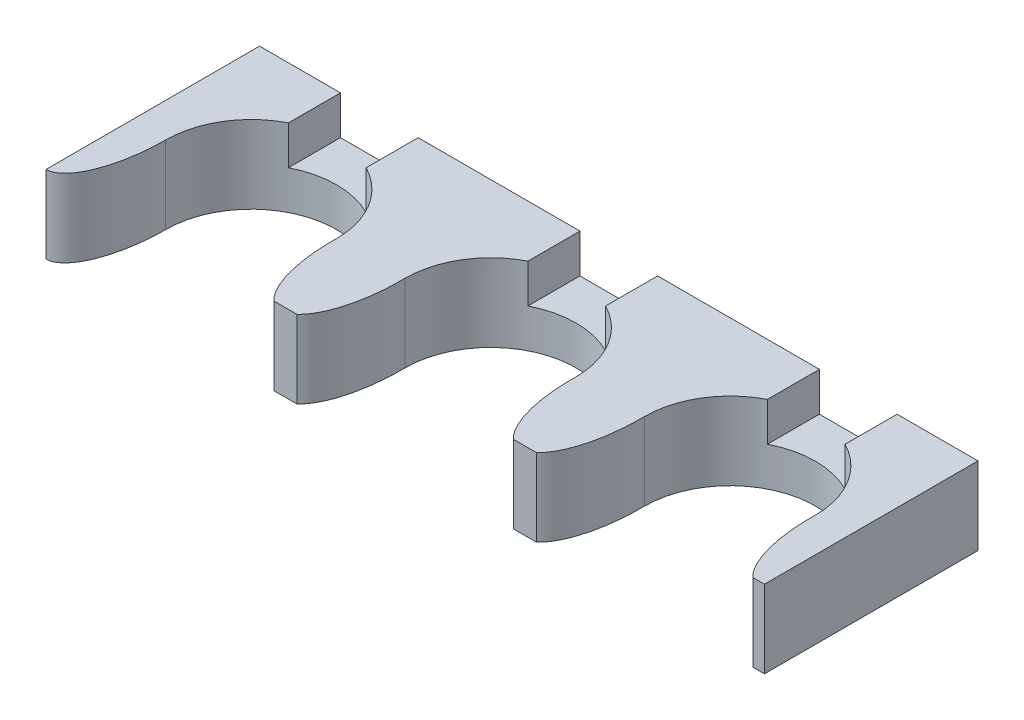
ISO-10303-21;
HEADER;
FILE_DESCRIPTION(('STEP AP214'),'2;1');
FILE_NAME('part.step','',(''),(''),'','','');
FILE_SCHEMA(('AUTOMOTIVE_DESIGN { 1 0 10303 214 1 1 1 1 }'));
ENDSEC;
DATA;
#1=APPLICATION_CONTEXT('core data for automotive mechanical design processes');
#2=APPLICATION_PROTOCOL_DEFINITION('international standard','automotive_design',2000,#1);
#3=PRODUCT_CONTEXT('',#1,'mechanical');
#4=PRODUCT('Part','Part','',(#3));
#5=PRODUCT_RELATED_PRODUCT_CATEGORY('part','',(#4));
#6=PRODUCT_DEFINITION_FORMATION('','',#4);
#7=PRODUCT_DEFINITION_CONTEXT('part definition',#1,'design');
#8=PRODUCT_DEFINITION('design','',#6,#7);
#9=PRODUCT_DEFINITION_SHAPE('','',#8);
#10=(LENGTH_UNIT() NAMED_UNIT(*) SI_UNIT(.MILLI.,.METRE.));
#11=(NAMED_UNIT(*) PLANE_ANGLE_UNIT() SI_UNIT($,.RADIAN.));
#12=(NAMED_UNIT(*) SI_UNIT($,.STERADIAN.) SOLID_ANGLE_UNIT());
#13=UNCERTAINTY_MEASURE_WITH_UNIT(LENGTH_MEASURE(1.E-05),#10,'distance_accuracy_value','');
#14=(GEOMETRIC_REPRESENTATION_CONTEXT(3) GLOBAL_UNCERTAINTY_ASSIGNED_CONTEXT((#13)) GLOBAL_UNIT_ASSIGNED_CONTEXT((#10,
#11,#12)) REPRESENTATION_CONTEXT('',''));
#15=CARTESIAN_POINT('',(0.,0.,0.));
#16=DIRECTION('',(0.,0.,1.));
#17=DIRECTION('',(1.,0.,0.));
#18=AXIS2_PLACEMENT_3D('',#15,#16,#17);
#19=CARTESIAN_POINT('',(-79.0983437687487,50.8,92.8118565395786));
#20=DIRECTION('',(0.,1.,0.));
#21=DIRECTION('',(0.,0.,1.));
#22=AXIS2_PLACEMENT_3D('',#19,#20,#21);
#23=PLANE('',#22);
#24=DIRECTION('',(0.,0.,-1.));
#25=VECTOR('',#24,1.);
#26=CARTESIAN_POINT('',(24.6174762312513,50.8,92.8118565395786));
#27=LINE('',#26,#25);
#28=CARTESIAN_POINT('',(24.6174762312513,50.8,-12.8421638829201));
#29=VERTEX_POINT('',#28);
#30=CARTESIAN_POINT('',(24.6174762312513,50.8,-46.8881434604214));
#31=VERTEX_POINT('',#30);
#32=EDGE_CURVE('E254',#29,#31,#27,.T.);
#33=ORIENTED_EDGE('',*,*,#32,.F.);
#34=CARTESIAN_POINT('',(-0.78176176874864,50.8,36.9318565395786));
#35=DIRECTION('',(0.,1.,0.));
#36=DIRECTION('',(0.,0.,1.));
#37=AXIS2_PLACEMENT_3D('',#34,#35,#36);
#38=CIRCLE('',#37,55.8799999999997);
#39=CARTESIAN_POINT('',(55.0982382312512,50.8,36.9318565395786));
#40=VERTEX_POINT('',#39);
#41=EDGE_CURVE('E402',#40,#29,#38,.T.);
#42=ORIENTED_EDGE('',*,*,#41,.F.);
#43=DIRECTION('',(0.,0.,1.));
#44=VECTOR('',#43,1.);
#45=CARTESIAN_POINT('',(55.0982382312514,50.8,22.9618565395786));
#46=LINE('',#45,#44);
#47=CARTESIAN_POINT('',(55.0982382312514,50.8,42.2665928727645));
#48=VERTEX_POINT('',#47);
#49=EDGE_CURVE('E395',#40,#48,#46,.T.);
#50=ORIENTED_EDGE('',*,*,#49,.T.);
#51=CARTESIAN_POINT('',(77.5180562312513,50.8,40.1068565395797));
#52=DIRECTION('',(0.,1.,0.));
#53=DIRECTION('',(0.,0.,1.));
#54=AXIS2_PLACEMENT_3D('',#51,#52,#53);
#55=ELLIPSE('',#54,55.8799999999989,22.4365820000002);
#56=CARTESIAN_POINT('',(70.0628942805316,50.8,92.8118565395786));
#57=VERTEX_POINT('',#56);
#58=EDGE_CURVE('E382',#48,#57,#55,.T.);
#59=ORIENTED_EDGE('',*,*,#58,.T.);
#60=DIRECTION('',(1.,0.,0.));
#61=VECTOR('',#60,1.);
#62=CARTESIAN_POINT('',(-79.0983437687487,50.8,92.8118565395786));
#63=LINE('',#62,#61);
#64=CARTESIAN_POINT('',(84.9732181819711,50.8,92.8118565395786));
#65=VERTEX_POINT('',#64);
#66=EDGE_CURVE('E457',#57,#65,#63,.T.);
#67=ORIENTED_EDGE('',*,*,#66,.T.);
#68=CARTESIAN_POINT('',(77.5180562312513,50.8,40.1068565395797));
#69=DIRECTION('',(0.,1.,0.));
#70=DIRECTION('',(0.,0.,1.));
#71=AXIS2_PLACEMENT_3D('',#68,#69,#70);
#72=ELLIPSE('',#71,55.8799999999989,22.4365820000002);
#73=CARTESIAN_POINT('',(99.9183928811012,50.8,36.9318565395786));
#74=VERTEX_POINT('',#73);
#75=EDGE_CURVE('E354',#65,#74,#72,.T.);
#76=ORIENTED_EDGE('',*,*,#75,.T.);
#77=DIRECTION('',(1.,0.,0.));
#78=VECTOR('',#77,1.);
#79=CARTESIAN_POINT('',(-259.81268432839,50.8,36.9318565395786));
#80=LINE('',#79,#78);
#81=CARTESIAN_POINT('',(99.9716562312513,50.8,36.9318565395786));
#82=VERTEX_POINT('',#81);
#83=EDGE_CURVE('E361',#74,#82,#80,.T.);
#84=ORIENTED_EDGE('',*,*,#83,.T.);
#85=CARTESIAN_POINT('',(155.851656231251,50.8,36.9318565395786));
#86=DIRECTION('',(0.,1.,0.));
#87=DIRECTION('',(0.,0.,1.));
#88=AXIS2_PLACEMENT_3D('',#85,#86,#87);
#89=CIRCLE('',#88,55.88);
#90=CARTESIAN_POINT('',(130.451656231251,50.8,-12.8417750337756));
#91=VERTEX_POINT('',#90);
#92=EDGE_CURVE('E426',#91,#82,#89,.T.);
#93=ORIENTED_EDGE('',*,*,#92,.F.);
#94=DIRECTION('',(0.,0.,-1.));
#95=VECTOR('',#94,1.);
#96=CARTESIAN_POINT('',(130.451656231251,50.8,92.8118565395786));
#97=LINE('',#96,#95);
#98=CARTESIAN_POINT('',(130.451656231251,50.8,-46.8881434604214));
#99=VERTEX_POINT('',#98);
#100=EDGE_CURVE('E280',#91,#99,#97,.T.);
#101=ORIENTED_EDGE('',*,*,#100,.T.);
#102=DIRECTION('',(-1.,0.,0.));
#103=VECTOR('',#102,1.);
#104=CARTESIAN_POINT('',(-79.0983437687487,50.8,-46.8881434604214));
#105=LINE('',#104,#103);
#106=EDGE_CURVE('E532',#99,#31,#105,.T.);
#107=ORIENTED_EDGE('',*,*,#106,.T.);
#108=EDGE_LOOP('',(#33,#42,#50,#59,#67,#76,#84,#93,#101,#107));
#109=FACE_BOUND('',#108,.T.);
#110=ADVANCED_FACE('F32',(#109),#23,.T.);
#111=DIRECTION('',(0.,0.,-1.));
#112=VECTOR('',#111,1.);
#113=CARTESIAN_POINT('',(181.251656231251,50.8,92.8118565395786));
#114=LINE('',#113,#112);
#115=CARTESIAN_POINT('',(181.251656231251,50.8,-12.8417750337756));
#116=VERTEX_POINT('',#115);
#117=CARTESIAN_POINT('',(181.251656231251,50.8,-46.8881434604214));
#118=VERTEX_POINT('',#117);
#119=EDGE_CURVE('E277',#116,#118,#114,.T.);
#120=ORIENTED_EDGE('',*,*,#119,.F.);
#121=CARTESIAN_POINT('',(211.731656231251,50.8,36.9318565395786));
#122=VERTEX_POINT('',#121);
#123=EDGE_CURVE('E420',#122,#116,#89,.T.);
#124=ORIENTED_EDGE('',*,*,#123,.F.);
#125=DIRECTION('',(0.,0.,1.));
#126=VECTOR('',#125,1.);
#127=CARTESIAN_POINT('',(211.731656231251,50.8,22.9618565395789));
#128=LINE('',#127,#126);
#129=CARTESIAN_POINT('',(211.731656231251,50.8,43.1721509155875));
#130=VERTEX_POINT('',#129);
#131=EDGE_CURVE('E414',#122,#130,#128,.T.);
#132=ORIENTED_EDGE('',*,*,#131,.T.);
#133=CARTESIAN_POINT('',(234.134456231251,50.8,40.1068565395797));
#134=DIRECTION('',(0.,1.,0.));
#135=DIRECTION('',(0.,0.,1.));
#136=AXIS2_PLACEMENT_3D('',#133,#134,#135);
#137=ELLIPSE('',#136,55.8799999999989,22.4365820000002);
#138=CARTESIAN_POINT('',(226.679294280532,50.8,92.8118565395786));
#139=VERTEX_POINT('',#138);
#140=EDGE_CURVE('E344',#130,#139,#137,.T.);
#141=ORIENTED_EDGE('',*,*,#140,.T.);
#142=CARTESIAN_POINT('',(241.589618181971,50.8,92.8118565395786));
#143=VERTEX_POINT('',#142);
#144=EDGE_CURVE('E461',#139,#143,#63,.T.);
#145=ORIENTED_EDGE('',*,*,#144,.T.);
#146=CARTESIAN_POINT('',(234.134456231251,50.8,40.1068565395797));
#147=DIRECTION('',(0.,1.,0.));
#148=DIRECTION('',(0.,0.,1.));
#149=AXIS2_PLACEMENT_3D('',#146,#147,#148);
#150=ELLIPSE('',#149,55.8799999999989,22.4365820000002);
#151=CARTESIAN_POINT('',(256.534792881101,50.8,36.9318565395786));
#152=VERTEX_POINT('',#151);
#153=EDGE_CURVE('E335',#143,#152,#150,.T.);
#154=ORIENTED_EDGE('',*,*,#153,.T.);
#155=DIRECTION('',(1.,0.,0.));
#156=VECTOR('',#155,1.);
#157=CARTESIAN_POINT('',(-259.81268432839,50.8,36.9318565395786));
#158=LINE('',#157,#156);
#159=CARTESIAN_POINT('',(256.605074231251,50.8,36.9318565395786));
#160=VERTEX_POINT('',#159);
#161=EDGE_CURVE('E332',#152,#160,#158,.T.);
#162=ORIENTED_EDGE('',*,*,#161,.T.);
#163=CARTESIAN_POINT('',(312.485074231251,50.8,36.9318565395786));
#164=DIRECTION('',(0.,1.,0.));
#165=DIRECTION('',(0.,0.,1.));
#166=AXIS2_PLACEMENT_3D('',#163,#164,#165);
#167=CIRCLE('',#166,55.88);
#168=CARTESIAN_POINT('',(287.085836231251,50.8,-12.8421638829205));
#169=VERTEX_POINT('',#168);
#170=EDGE_CURVE('E444',#169,#160,#167,.T.);
#171=ORIENTED_EDGE('',*,*,#170,.F.);
#172=DIRECTION('',(0.,0.,-1.));
#173=VECTOR('',#172,1.);
#174=CARTESIAN_POINT('',(287.085836231251,50.8,92.8118565395786));
#175=LINE('',#174,#173);
#176=CARTESIAN_POINT('',(287.085836231251,50.8,-46.8881434604214));
#177=VERTEX_POINT('',#176);
#178=EDGE_CURVE('E296',#169,#177,#175,.T.);
#179=ORIENTED_EDGE('',*,*,#178,.T.);
#180=EDGE_CURVE('E468',#177,#118,#105,.T.);
#181=ORIENTED_EDGE('',*,*,#180,.T.);
#182=EDGE_LOOP('',(#120,#124,#132,#141,#145,#154,#162,#171,#179,#181));
#183=FACE_BOUND('',#182,.T.);
#184=ADVANCED_FACE('F574',(#183),#23,.T.);
#185=DIRECTION('',(0.,0.,-1.));
#186=VECTOR('',#185,1.);
#187=CARTESIAN_POINT('',(337.885836231251,50.8,92.8118565395786));
#188=LINE('',#187,#186);
#189=CARTESIAN_POINT('',(337.885836231251,50.8,-12.841386169927));
#190=VERTEX_POINT('',#189);
#191=CARTESIAN_POINT('',(337.885836231251,50.8,-46.8881434604214));
#192=VERTEX_POINT('',#191);
#193=EDGE_CURVE('E293',#190,#192,#188,.T.);
#194=ORIENTED_EDGE('',*,*,#193,.F.);
#195=CARTESIAN_POINT('',(368.365074231251,50.8,36.9318565395786));
#196=VERTEX_POINT('',#195);
#197=EDGE_CURVE('E438',#196,#190,#167,.T.);
#198=ORIENTED_EDGE('',*,*,#197,.F.);
#199=DIRECTION('',(0.,0.,1.));
#200=VECTOR('',#199,1.);
#201=CARTESIAN_POINT('',(368.365074231251,50.8,22.9618565395792));
#202=LINE('',#201,#200);
#203=CARTESIAN_POINT('',(368.365074231251,50.8,43.8650482967298));
#204=VERTEX_POINT('',#203);
#205=EDGE_CURVE('E432',#196,#204,#202,.T.);
#206=ORIENTED_EDGE('',*,*,#205,.T.);
#207=CARTESIAN_POINT('',(390.750856231251,50.8,40.1068565395797));
#208=DIRECTION('',(0.,1.,0.));
#209=DIRECTION('',(0.,0.,1.));
#210=AXIS2_PLACEMENT_3D('',#207,#208,#209);
#211=ELLIPSE('',#210,55.8799999999989,22.4365820000002);
#212=CARTESIAN_POINT('',(383.295694280532,50.8,92.8118565395786));
#213=VERTEX_POINT('',#212);
#214=EDGE_CURVE('E295',#204,#213,#211,.T.);
#215=ORIENTED_EDGE('',*,*,#214,.T.);
#216=CARTESIAN_POINT('',(390.801656231251,50.8,92.8118565395786));
#217=VERTEX_POINT('',#216);
#218=EDGE_CURVE('E455',#213,#217,#63,.T.);
#219=ORIENTED_EDGE('',*,*,#218,.T.);
#220=DIRECTION('',(0.,0.,-1.));
#221=VECTOR('',#220,1.);
#222=CARTESIAN_POINT('',(390.801656231251,50.8,-46.8881434604214));
#223=LINE('',#222,#221);
#224=CARTESIAN_POINT('',(390.801656231251,50.8,-46.8881434604214));
#225=VERTEX_POINT('',#224);
#226=EDGE_CURVE('E460',#217,#225,#223,.T.);
#227=ORIENTED_EDGE('',*,*,#226,.T.);
#228=EDGE_CURVE('E464',#225,#192,#105,.T.);
#229=ORIENTED_EDGE('',*,*,#228,.T.);
#230=EDGE_LOOP('',(#194,#198,#206,#215,#219,#227,#229));
#231=FACE_BOUND('',#230,.T.);
#232=ADVANCED_FACE('F551',(#231),#23,.T.);
#233=DIRECTION('',(0.,0.,-1.));
#234=VECTOR('',#233,1.);
#235=CARTESIAN_POINT('',(-26.1825237687487,50.8,92.8118565395786));
#236=LINE('',#235,#234);
#237=CARTESIAN_POINT('',(-26.1825237687487,50.8,-12.8413861699266));
#238=VERTEX_POINT('',#237);
#239=CARTESIAN_POINT('',(-26.1825237687487,50.8,-46.8881434604214));
#240=VERTEX_POINT('',#239);
#241=EDGE_CURVE('E266',#238,#240,#236,.T.);
#242=ORIENTED_EDGE('',*,*,#241,.T.);
#243=CARTESIAN_POINT('',(-79.0983437687487,50.8,-46.8881434604214));
#244=VERTEX_POINT('',#243);
#245=EDGE_CURVE('E463',#240,#244,#105,.T.);
#246=ORIENTED_EDGE('',*,*,#245,.T.);
#247=DIRECTION('',(0.,0.,1.));
#248=VECTOR('',#247,1.);
#249=CARTESIAN_POINT('',(-79.0983437687487,50.8,-46.8881434604214));
#250=LINE('',#249,#248);
#251=CARTESIAN_POINT('',(-79.0983437687487,50.8,92.8118565395786));
#252=VERTEX_POINT('',#251);
#253=EDGE_CURVE('E452',#244,#252,#250,.T.);
#254=ORIENTED_EDGE('',*,*,#253,.T.);
#255=CARTESIAN_POINT('',(-79.0983437687487,50.8,36.9318565395786));
#256=DIRECTION('',(0.,1.,0.));
#257=DIRECTION('',(0.,0.,1.));
#258=AXIS2_PLACEMENT_3D('',#255,#256,#257);
#259=ELLIPSE('',#258,55.88,22.4365820000002);
#260=CARTESIAN_POINT('',(-56.6617617687487,50.8,36.9318565395786));
#261=VERTEX_POINT('',#260);
#262=EDGE_CURVE('E390',#252,#261,#259,.T.);
#263=ORIENTED_EDGE('',*,*,#262,.T.);
#264=EDGE_CURVE('E408',#238,#261,#38,.T.);
#265=ORIENTED_EDGE('',*,*,#264,.F.);
#266=EDGE_LOOP('',(#242,#246,#254,#263,#265));
#267=FACE_BOUND('',#266,.T.);
#268=ADVANCED_FACE('F514',(#267),#23,.T.);
#269=CARTESIAN_POINT('',(-79.0983437687487,0.,92.8118565395786));
#270=DIRECTION('',(0.,1.,0.));
#271=DIRECTION('',(0.,0.,1.));
#272=AXIS2_PLACEMENT_3D('',#269,#270,#271);
#273=PLANE('',#272);
#274=CARTESIAN_POINT('',(390.750856231251,0.,40.1068565395797));
#275=DIRECTION('',(0.,1.,0.));
#276=DIRECTION('',(0.,0.,1.));
#277=AXIS2_PLACEMENT_3D('',#274,#275,#276);
#278=ELLIPSE('',#277,55.8799999999989,22.4365820000002);
#279=CARTESIAN_POINT('',(368.365074231251,0.,43.8650482967298));
#280=VERTEX_POINT('',#279);
#281=CARTESIAN_POINT('',(383.295694280532,0.,92.8118565395786));
#282=VERTEX_POINT('',#281);
#283=EDGE_CURVE('E302',#280,#282,#278,.T.);
#284=ORIENTED_EDGE('',*,*,#283,.F.);
#285=DIRECTION('',(0.,0.,1.));
#286=VECTOR('',#285,1.);
#287=CARTESIAN_POINT('',(368.365074231251,0.,22.9618565395792));
#288=LINE('',#287,#286);
#289=CARTESIAN_POINT('',(368.365074231251,0.,36.9318565395786));
#290=VERTEX_POINT('',#289);
#291=EDGE_CURVE('E434',#290,#280,#288,.T.);
#292=ORIENTED_EDGE('',*,*,#291,.F.);
#293=CARTESIAN_POINT('',(312.485074231251,0.,36.9318565395786));
#294=DIRECTION('',(0.,1.,0.));
#295=DIRECTION('',(0.,0.,1.));
#296=AXIS2_PLACEMENT_3D('',#293,#294,#295);
#297=CIRCLE('',#296,55.88);
#298=CARTESIAN_POINT('',(256.605074231251,0.,36.9318565395786));
#299=VERTEX_POINT('',#298);
#300=EDGE_CURVE('E437',#290,#299,#297,.T.);
#301=ORIENTED_EDGE('',*,*,#300,.T.);
#302=DIRECTION('',(1.,0.,0.));
#303=VECTOR('',#302,1.);
#304=CARTESIAN_POINT('',(-259.81268432839,0.,36.9318565395786));
#305=LINE('',#304,#303);
#306=CARTESIAN_POINT('',(256.534792881101,0.,36.9318565395786));
#307=VERTEX_POINT('',#306);
#308=EDGE_CURVE('E331',#307,#299,#305,.T.);
#309=ORIENTED_EDGE('',*,*,#308,.F.);
#310=CARTESIAN_POINT('',(234.134456231251,0.,40.1068565395797));
#311=DIRECTION('',(0.,1.,0.));
#312=DIRECTION('',(0.,0.,1.));
#313=AXIS2_PLACEMENT_3D('',#310,#311,#312);
#314=ELLIPSE('',#313,55.8799999999989,22.4365820000002);
#315=CARTESIAN_POINT('',(241.589618181971,0.,92.8118565395786));
#316=VERTEX_POINT('',#315);
#317=EDGE_CURVE('E327',#316,#307,#314,.T.);
#318=ORIENTED_EDGE('',*,*,#317,.F.);
#319=DIRECTION('',(1.,0.,0.));
#320=VECTOR('',#319,1.);
#321=CARTESIAN_POINT('',(-79.0983437687487,0.,92.8118565395786));
#322=LINE('',#321,#320);
#323=CARTESIAN_POINT('',(226.679294280532,0.,92.8118565395786));
#324=VERTEX_POINT('',#323);
#325=EDGE_CURVE('E476',#324,#316,#322,.T.);
#326=ORIENTED_EDGE('',*,*,#325,.F.);
#327=CARTESIAN_POINT('',(234.134456231251,0.,40.1068565395797));
#328=DIRECTION('',(0.,1.,0.));
#329=DIRECTION('',(0.,0.,1.));
#330=AXIS2_PLACEMENT_3D('',#327,#328,#329);
#331=ELLIPSE('',#330,55.8799999999989,22.4365820000002);
#332=CARTESIAN_POINT('',(211.731656231251,0.,43.1721509155875));
#333=VERTEX_POINT('',#332);
#334=EDGE_CURVE('E346',#333,#324,#331,.T.);
#335=ORIENTED_EDGE('',*,*,#334,.F.);
#336=DIRECTION('',(0.,0.,1.));
#337=VECTOR('',#336,1.);
#338=CARTESIAN_POINT('',(211.731656231251,0.,22.9618565395789));
#339=LINE('',#338,#337);
#340=CARTESIAN_POINT('',(211.731656231251,0.,36.9318565395786));
#341=VERTEX_POINT('',#340);
#342=EDGE_CURVE('E416',#341,#333,#339,.T.);
#343=ORIENTED_EDGE('',*,*,#342,.F.);
#344=CARTESIAN_POINT('',(155.851656231251,0.,36.9318565395786));
#345=DIRECTION('',(0.,1.,0.));
#346=DIRECTION('',(0.,0.,1.));
#347=AXIS2_PLACEMENT_3D('',#344,#345,#346);
#348=CIRCLE('',#347,55.88);
#349=CARTESIAN_POINT('',(99.9716562312513,0.,36.9318565395786));
#350=VERTEX_POINT('',#349);
#351=EDGE_CURVE('E419',#341,#350,#348,.T.);
#352=ORIENTED_EDGE('',*,*,#351,.T.);
#353=DIRECTION('',(1.,0.,0.));
#354=VECTOR('',#353,1.);
#355=CARTESIAN_POINT('',(-259.81268432839,0.,36.9318565395786));
#356=LINE('',#355,#354);
#357=CARTESIAN_POINT('',(99.9183928811012,0.,36.9318565395786));
#358=VERTEX_POINT('',#357);
#359=EDGE_CURVE('E360',#358,#350,#356,.T.);
#360=ORIENTED_EDGE('',*,*,#359,.F.);
#361=CARTESIAN_POINT('',(77.5180562312513,0.,40.1068565395797));
#362=DIRECTION('',(0.,1.,0.));
#363=DIRECTION('',(0.,0.,1.));
#364=AXIS2_PLACEMENT_3D('',#361,#362,#363);
#365=ELLIPSE('',#364,55.8799999999989,22.4365820000002);
#366=CARTESIAN_POINT('',(84.9732181819711,0.,92.8118565395786));
#367=VERTEX_POINT('',#366);
#368=EDGE_CURVE('E357',#367,#358,#365,.T.);
#369=ORIENTED_EDGE('',*,*,#368,.F.);
#370=CARTESIAN_POINT('',(70.0628942805316,0.,92.8118565395786));
#371=VERTEX_POINT('',#370);
#372=EDGE_CURVE('E472',#371,#367,#322,.T.);
#373=ORIENTED_EDGE('',*,*,#372,.F.);
#374=CARTESIAN_POINT('',(77.5180562312513,0.,40.1068565395797));
#375=DIRECTION('',(0.,1.,0.));
#376=DIRECTION('',(0.,0.,1.));
#377=AXIS2_PLACEMENT_3D('',#374,#375,#376);
#378=ELLIPSE('',#377,55.8799999999989,22.4365820000002);
#379=CARTESIAN_POINT('',(55.0982382312514,0.,42.2665928727645));
#380=VERTEX_POINT('',#379);
#381=EDGE_CURVE('E377',#380,#371,#378,.T.);
#382=ORIENTED_EDGE('',*,*,#381,.F.);
#383=DIRECTION('',(0.,0.,1.));
#384=VECTOR('',#383,1.);
#385=CARTESIAN_POINT('',(55.0982382312514,0.,22.9618565395786));
#386=LINE('',#385,#384);
#387=CARTESIAN_POINT('',(55.0982382312512,0.,36.9318565395786));
#388=VERTEX_POINT('',#387);
#389=EDGE_CURVE('E398',#388,#380,#386,.T.);
#390=ORIENTED_EDGE('',*,*,#389,.F.);
#391=CARTESIAN_POINT('',(-0.78176176874864,0.,36.9318565395786));
#392=DIRECTION('',(0.,1.,0.));
#393=DIRECTION('',(0.,0.,1.));
#394=AXIS2_PLACEMENT_3D('',#391,#392,#393);
#395=CIRCLE('',#394,55.8799999999997);
#396=CARTESIAN_POINT('',(-56.6617617687483,0.,36.9318565395786));
#397=VERTEX_POINT('',#396);
#398=EDGE_CURVE('E401',#388,#397,#395,.T.);
#399=ORIENTED_EDGE('',*,*,#398,.T.);
#400=CARTESIAN_POINT('',(-79.0983437687487,0.,36.9318565395786));
#401=DIRECTION('',(0.,1.,0.));
#402=DIRECTION('',(0.,0.,1.));
#403=AXIS2_PLACEMENT_3D('',#400,#401,#402);
#404=ELLIPSE('',#403,55.88,22.4365820000002);
#405=CARTESIAN_POINT('',(-79.0983437687487,0.,92.8118565395786));
#406=VERTEX_POINT('',#405);
#407=EDGE_CURVE('E392',#406,#397,#404,.T.);
#408=ORIENTED_EDGE('',*,*,#407,.F.);
#409=DIRECTION('',(0.,0.,1.));
#410=VECTOR('',#409,1.);
#411=CARTESIAN_POINT('',(-79.0983437687487,0.,-46.8881434604214));
#412=LINE('',#411,#410);
#413=CARTESIAN_POINT('',(-79.0983437687487,0.,-46.8881434604214));
#414=VERTEX_POINT('',#413);
#415=EDGE_CURVE('E450',#414,#406,#412,.T.);
#416=ORIENTED_EDGE('',*,*,#415,.F.);
#417=DIRECTION('',(-1.,0.,0.));
#418=VECTOR('',#417,1.);
#419=CARTESIAN_POINT('',(-79.0983437687487,0.,-46.8881434604214));
#420=LINE('',#419,#418);
#421=CARTESIAN_POINT('',(390.801656231251,0.,-46.8881434604214));
#422=VERTEX_POINT('',#421);
#423=EDGE_CURVE('E456',#422,#414,#420,.T.);
#424=ORIENTED_EDGE('',*,*,#423,.F.);
#425=DIRECTION('',(0.,0.,-1.));
#426=VECTOR('',#425,1.);
#427=CARTESIAN_POINT('',(390.801656231251,0.,-46.8881434604214));
#428=LINE('',#427,#426);
#429=CARTESIAN_POINT('',(390.801656231251,0.,92.8118565395786));
#430=VERTEX_POINT('',#429);
#431=EDGE_CURVE('E475',#430,#422,#428,.T.);
#432=ORIENTED_EDGE('',*,*,#431,.F.);
#433=EDGE_CURVE('E471',#282,#430,#322,.T.);
#434=ORIENTED_EDGE('',*,*,#433,.F.);
#435=EDGE_LOOP('',(#284,#292,#301,#309,#318,#326,#335,#343,#352,#360,#369,#373,#382,#390,#399,
#408,#416,#424,#432,#434));
#436=FACE_BOUND('',#435,.T.);
#437=ADVANCED_FACE('F523',(#436),#273,.F.);
#438=CARTESIAN_POINT('',(-79.0983437687487,50.8,92.8118565395786));
#439=DIRECTION('',(0.,0.,-1.));
#440=DIRECTION('',(-1.,0.,0.));
#441=AXIS2_PLACEMENT_3D('',#438,#439,#440);
#442=PLANE('',#441);
#443=DIRECTION('',(0.,1.,0.));
#444=VECTOR('',#443,1.);
#445=CARTESIAN_POINT('',(383.295694280532,0.,92.8118565395786));
#446=LINE('',#445,#444);
#447=EDGE_CURVE('E338',#282,#213,#446,.T.);
#448=ORIENTED_EDGE('',*,*,#447,.F.);
#449=ORIENTED_EDGE('',*,*,#433,.T.);
#450=DIRECTION('',(0.,-1.,0.));
#451=VECTOR('',#450,1.);
#452=CARTESIAN_POINT('',(390.801656231251,50.8,92.8118565395786));
#453=LINE('',#452,#451);
#454=EDGE_CURVE('E484',#217,#430,#453,.T.);
#455=ORIENTED_EDGE('',*,*,#454,.F.);
#456=ORIENTED_EDGE('',*,*,#218,.F.);
#457=EDGE_LOOP('',(#448,#449,#455,#456));
#458=FACE_BOUND('',#457,.T.);
#459=ADVANCED_FACE('F557',(#458),#442,.F.);
#460=CARTESIAN_POINT('',(368.365074231251,0.,22.9618565395792));
#461=DIRECTION('',(-1.,0.,0.));
#462=DIRECTION('',(0.,0.,1.));
#463=AXIS2_PLACEMENT_3D('',#460,#461,#462);
#464=PLANE('',#463);
#465=ORIENTED_EDGE('',*,*,#291,.T.);
#466=DIRECTION('',(0.,1.,0.));
#467=VECTOR('',#466,1.);
#468=CARTESIAN_POINT('',(368.365074231251,0.,43.8650482967298));
#469=LINE('',#468,#467);
#470=EDGE_CURVE('E305',#280,#204,#469,.T.);
#471=ORIENTED_EDGE('',*,*,#470,.T.);
#472=ORIENTED_EDGE('',*,*,#205,.F.);
#473=DIRECTION('',(0.,1.,0.));
#474=VECTOR('',#473,1.);
#475=CARTESIAN_POINT('',(368.365074231251,0.,36.9318565395786));
#476=LINE('',#475,#474);
#477=EDGE_CURVE('E441',#290,#196,#476,.T.);
#478=ORIENTED_EDGE('',*,*,#477,.F.);
#479=EDGE_LOOP('',(#465,#471,#472,#478));
#480=FACE_BOUND('',#479,.T.);
#481=ADVANCED_FACE('F606',(#480),#464,.T.);
#482=DIRECTION('',(0.,1.,0.));
#483=VECTOR('',#482,1.);
#484=CARTESIAN_POINT('',(241.589618181971,0.,92.8118565395786));
#485=LINE('',#484,#483);
#486=EDGE_CURVE('E334',#316,#143,#485,.T.);
#487=ORIENTED_EDGE('',*,*,#486,.T.);
#488=ORIENTED_EDGE('',*,*,#144,.F.);
#489=DIRECTION('',(0.,1.,0.));
#490=VECTOR('',#489,1.);
#491=CARTESIAN_POINT('',(226.679294280532,0.,92.8118565395786));
#492=LINE('',#491,#490);
#493=EDGE_CURVE('E352',#324,#139,#492,.T.);
#494=ORIENTED_EDGE('',*,*,#493,.F.);
#495=ORIENTED_EDGE('',*,*,#325,.T.);
#496=EDGE_LOOP('',(#487,#488,#494,#495));
#497=FACE_BOUND('',#496,.T.);
#498=ADVANCED_FACE('F562',(#497),#442,.F.);
#499=CARTESIAN_POINT('',(211.731656231251,0.,22.9618565395789));
#500=DIRECTION('',(-1.,0.,0.));
#501=DIRECTION('',(0.,0.,1.));
#502=AXIS2_PLACEMENT_3D('',#499,#500,#501);
#503=PLANE('',#502);
#504=ORIENTED_EDGE('',*,*,#342,.T.);
#505=DIRECTION('',(0.,1.,0.));
#506=VECTOR('',#505,1.);
#507=CARTESIAN_POINT('',(211.731656231251,0.,43.1721509155875));
#508=LINE('',#507,#506);
#509=EDGE_CURVE('E349',#333,#130,#508,.T.);
#510=ORIENTED_EDGE('',*,*,#509,.T.);
#511=ORIENTED_EDGE('',*,*,#131,.F.);
#512=DIRECTION('',(0.,1.,0.));
#513=VECTOR('',#512,1.);
#514=CARTESIAN_POINT('',(211.731656231251,0.,36.9318565395786));
#515=LINE('',#514,#513);
#516=EDGE_CURVE('E423',#341,#122,#515,.T.);
#517=ORIENTED_EDGE('',*,*,#516,.F.);
#518=EDGE_LOOP('',(#504,#510,#511,#517));
#519=FACE_BOUND('',#518,.T.);
#520=ADVANCED_FACE('F579',(#519),#503,.T.);
#521=DIRECTION('',(0.,1.,0.));
#522=VECTOR('',#521,1.);
#523=CARTESIAN_POINT('',(84.9732181819711,0.,92.8118565395786));
#524=LINE('',#523,#522);
#525=EDGE_CURVE('E383',#367,#65,#524,.T.);
#526=ORIENTED_EDGE('',*,*,#525,.T.);
#527=ORIENTED_EDGE('',*,*,#66,.F.);
#528=DIRECTION('',(0.,1.,0.));
#529=VECTOR('',#528,1.);
#530=CARTESIAN_POINT('',(70.0628942805316,0.,92.8118565395786));
#531=LINE('',#530,#529);
#532=EDGE_CURVE('E388',#371,#57,#531,.T.);
#533=ORIENTED_EDGE('',*,*,#532,.F.);
#534=ORIENTED_EDGE('',*,*,#372,.T.);
#535=EDGE_LOOP('',(#526,#527,#533,#534));
#536=FACE_BOUND('',#535,.T.);
#537=ADVANCED_FACE('F595',(#536),#442,.F.);
#538=CARTESIAN_POINT('',(55.0982382312514,0.,22.9618565395786));
#539=DIRECTION('',(-1.,0.,0.));
#540=DIRECTION('',(0.,0.,1.));
#541=AXIS2_PLACEMENT_3D('',#538,#539,#540);
#542=PLANE('',#541);
#543=ORIENTED_EDGE('',*,*,#389,.T.);
#544=DIRECTION('',(0.,1.,0.));
#545=VECTOR('',#544,1.);
#546=CARTESIAN_POINT('',(55.0982382312514,0.,42.2665928727645));
#547=LINE('',#546,#545);
#548=EDGE_CURVE('E381',#380,#48,#547,.T.);
#549=ORIENTED_EDGE('',*,*,#548,.T.);
#550=ORIENTED_EDGE('',*,*,#49,.F.);
#551=DIRECTION('',(0.,1.,0.));
#552=VECTOR('',#551,1.);
#553=CARTESIAN_POINT('',(55.0982382312512,0.,36.9318565395786));
#554=LINE('',#553,#552);
#555=EDGE_CURVE('E405',#388,#40,#554,.T.);
#556=ORIENTED_EDGE('',*,*,#555,.F.);
#557=EDGE_LOOP('',(#543,#549,#550,#556));
#558=FACE_BOUND('',#557,.T.);
#559=ADVANCED_FACE('F528',(#558),#542,.T.);
#560=CARTESIAN_POINT('',(-79.0983437687487,50.8,-46.8881434604214));
#561=DIRECTION('',(1.,0.,0.));
#562=DIRECTION('',(0.,0.,-1.));
#563=AXIS2_PLACEMENT_3D('',#560,#561,#562);
#564=PLANE('',#563);
#565=ORIENTED_EDGE('',*,*,#415,.T.);
#566=DIRECTION('',(0.,-1.,0.));
#567=VECTOR('',#566,1.);
#568=CARTESIAN_POINT('',(-79.0983437687487,50.8,92.8118565395786));
#569=LINE('',#568,#567);
#570=EDGE_CURVE('E487',#252,#406,#569,.T.);
#571=ORIENTED_EDGE('',*,*,#570,.F.);
#572=ORIENTED_EDGE('',*,*,#253,.F.);
#573=DIRECTION('',(0.,-1.,0.));
#574=VECTOR('',#573,1.);
#575=CARTESIAN_POINT('',(-79.0983437687487,50.8,-46.8881434604214));
#576=LINE('',#575,#574);
#577=EDGE_CURVE('E467',#244,#414,#576,.T.);
#578=ORIENTED_EDGE('',*,*,#577,.T.);
#579=EDGE_LOOP('',(#565,#571,#572,#578));
#580=FACE_BOUND('',#579,.T.);
#581=ADVANCED_FACE('F34',(#580),#564,.F.);
#582=CARTESIAN_POINT('',(390.801656231251,50.8,-46.8881434604214));
#583=DIRECTION('',(-1.,0.,0.));
#584=DIRECTION('',(0.,0.,1.));
#585=AXIS2_PLACEMENT_3D('',#582,#583,#584);
#586=PLANE('',#585);
#587=ORIENTED_EDGE('',*,*,#431,.T.);
#588=DIRECTION('',(0.,-1.,0.));
#589=VECTOR('',#588,1.);
#590=CARTESIAN_POINT('',(390.801656231251,50.8,-46.8881434604214));
#591=LINE('',#590,#589);
#592=EDGE_CURVE('E481',#225,#422,#591,.T.);
#593=ORIENTED_EDGE('',*,*,#592,.F.);
#594=ORIENTED_EDGE('',*,*,#226,.F.);
#595=ORIENTED_EDGE('',*,*,#454,.T.);
#596=EDGE_LOOP('',(#587,#593,#594,#595));
#597=FACE_BOUND('',#596,.T.);
#598=ADVANCED_FACE('F543',(#597),#586,.F.);
#599=CARTESIAN_POINT('',(-79.0983437687487,50.8,-46.8881434604214));
#600=DIRECTION('',(0.,0.,1.));
#601=DIRECTION('',(1.,0.,0.));
#602=AXIS2_PLACEMENT_3D('',#599,#600,#601);
#603=PLANE('',#602);
#604=DIRECTION('',(-1.,0.,0.));
#605=VECTOR('',#604,1.);
#606=CARTESIAN_POINT('',(24.6174762312513,25.4,-46.8881434604214));
#607=LINE('',#606,#605);
#608=CARTESIAN_POINT('',(24.6174762312513,25.4,-46.8881434604214));
#609=VERTEX_POINT('',#608);
#610=CARTESIAN_POINT('',(-26.1825237687487,25.4,-46.8881434604214));
#611=VERTEX_POINT('',#610);
#612=EDGE_CURVE('E243',#609,#611,#607,.T.);
#613=ORIENTED_EDGE('',*,*,#612,.F.);
#614=DIRECTION('',(0.,-1.,0.));
#615=VECTOR('',#614,1.);
#616=CARTESIAN_POINT('',(24.6174762312513,50.8,-46.8881434604214));
#617=LINE('',#616,#615);
#618=EDGE_CURVE('E251',#31,#609,#617,.T.);
#619=ORIENTED_EDGE('',*,*,#618,.F.);
#620=ORIENTED_EDGE('',*,*,#106,.F.);
#621=DIRECTION('',(0.,1.,0.));
#622=VECTOR('',#621,1.);
#623=CARTESIAN_POINT('',(130.451656231251,50.8,-46.8881434604214));
#624=LINE('',#623,#622);
#625=CARTESIAN_POINT('',(130.451656231251,25.4,-46.8881434604214));
#626=VERTEX_POINT('',#625);
#627=EDGE_CURVE('E274',#626,#99,#624,.T.);
#628=ORIENTED_EDGE('',*,*,#627,.F.);
#629=DIRECTION('',(-1.,0.,0.));
#630=VECTOR('',#629,1.);
#631=CARTESIAN_POINT('',(181.251656231251,25.4,-46.8881434604214));
#632=LINE('',#631,#630);
#633=CARTESIAN_POINT('',(181.251656231251,25.4,-46.8881434604214));
#634=VERTEX_POINT('',#633);
#635=EDGE_CURVE('E272',#634,#626,#632,.T.);
#636=ORIENTED_EDGE('',*,*,#635,.F.);
#637=DIRECTION('',(0.,-1.,0.));
#638=VECTOR('',#637,1.);
#639=CARTESIAN_POINT('',(181.251656231251,50.8,-46.8881434604214));
#640=LINE('',#639,#638);
#641=EDGE_CURVE('E265',#118,#634,#640,.T.);
#642=ORIENTED_EDGE('',*,*,#641,.F.);
#643=ORIENTED_EDGE('',*,*,#180,.F.);
#644=DIRECTION('',(0.,1.,0.));
#645=VECTOR('',#644,1.);
#646=CARTESIAN_POINT('',(287.085836231251,50.8,-46.8881434604214));
#647=LINE('',#646,#645);
#648=CARTESIAN_POINT('',(287.085836231251,25.4,-46.8881434604214));
#649=VERTEX_POINT('',#648);
#650=EDGE_CURVE('E290',#649,#177,#647,.T.);
#651=ORIENTED_EDGE('',*,*,#650,.F.);
#652=DIRECTION('',(-1.,0.,0.));
#653=VECTOR('',#652,1.);
#654=CARTESIAN_POINT('',(337.885836231251,25.4,-46.8881434604214));
#655=LINE('',#654,#653);
#656=CARTESIAN_POINT('',(337.885836231251,25.4,-46.8881434604214));
#657=VERTEX_POINT('',#656);
#658=EDGE_CURVE('E287',#657,#649,#655,.T.);
#659=ORIENTED_EDGE('',*,*,#658,.F.);
#660=DIRECTION('',(0.,-1.,0.));
#661=VECTOR('',#660,1.);
#662=CARTESIAN_POINT('',(337.885836231251,50.8,-46.8881434604214));
#663=LINE('',#662,#661);
#664=EDGE_CURVE('E279',#192,#657,#663,.T.);
#665=ORIENTED_EDGE('',*,*,#664,.F.);
#666=ORIENTED_EDGE('',*,*,#228,.F.);
#667=ORIENTED_EDGE('',*,*,#592,.T.);
#668=ORIENTED_EDGE('',*,*,#423,.T.);
#669=ORIENTED_EDGE('',*,*,#577,.F.);
#670=ORIENTED_EDGE('',*,*,#245,.F.);
#671=DIRECTION('',(0.,1.,0.));
#672=VECTOR('',#671,1.);
#673=CARTESIAN_POINT('',(-26.1825237687487,50.8,-46.8881434604214));
#674=LINE('',#673,#672);
#675=EDGE_CURVE('E248',#611,#240,#674,.T.);
#676=ORIENTED_EDGE('',*,*,#675,.F.);
#677=EDGE_LOOP('',(#613,#619,#620,#628,#636,#642,#643,#651,#659,#665,#666,#667,#668,#669,#670,#676));
#678=FACE_BOUND('',#677,.T.);
#679=ADVANCED_FACE('F259',(#678),#603,.F.);
#680=CARTESIAN_POINT('',(312.485074231251,0.,36.9318565395786));
#681=DIRECTION('',(0.,1.,0.));
#682=DIRECTION('',(0.,0.,1.));
#683=AXIS2_PLACEMENT_3D('',#680,#681,#682);
#684=CYLINDRICAL_SURFACE('',#683,55.88);
#685=ORIENTED_EDGE('',*,*,#197,.T.);
#686=DIRECTION('',(0.,1.,0.));
#687=VECTOR('',#686,1.);
#688=CARTESIAN_POINT('',(337.885836231251,0.,-12.841386169927));
#689=LINE('',#688,#687);
#690=CARTESIAN_POINT('',(337.885836231251,25.4,-12.841386169927));
#691=VERTEX_POINT('',#690);
#692=EDGE_CURVE('E495',#190,#691,#689,.F.);
#693=ORIENTED_EDGE('',*,*,#692,.T.);
#694=CARTESIAN_POINT('',(312.485074231251,25.4,36.9318565395786));
#695=DIRECTION('',(0.,-1.,0.));
#696=DIRECTION('',(0.,0.,-1.));
#697=AXIS2_PLACEMENT_3D('',#694,#695,#696);
#698=CIRCLE('',#697,55.88);
#699=CARTESIAN_POINT('',(287.085836231251,25.4,-12.8421638829205));
#700=VERTEX_POINT('',#699);
#701=EDGE_CURVE('E489',#691,#700,#698,.F.);
#702=ORIENTED_EDGE('',*,*,#701,.T.);
#703=DIRECTION('',(0.,1.,0.));
#704=VECTOR('',#703,1.);
#705=CARTESIAN_POINT('',(287.085836231251,0.,-12.8421638829205));
#706=LINE('',#705,#704);
#707=EDGE_CURVE('E492',#700,#169,#706,.T.);
#708=ORIENTED_EDGE('',*,*,#707,.T.);
#709=ORIENTED_EDGE('',*,*,#170,.T.);
#710=DIRECTION('',(0.,1.,0.));
#711=VECTOR('',#710,1.);
#712=CARTESIAN_POINT('',(256.605074231251,0.,36.9318565395786));
#713=LINE('',#712,#711);
#714=EDGE_CURVE('E447',#299,#160,#713,.T.);
#715=ORIENTED_EDGE('',*,*,#714,.F.);
#716=ORIENTED_EDGE('',*,*,#300,.F.);
#717=ORIENTED_EDGE('',*,*,#477,.T.);
#718=EDGE_LOOP('',(#685,#693,#702,#708,#709,#715,#716,#717));
#719=FACE_BOUND('',#718,.T.);
#720=ADVANCED_FACE('F751',(#719),#684,.F.);
#721=CARTESIAN_POINT('',(155.851656231251,0.,36.9318565395786));
#722=DIRECTION('',(0.,1.,0.));
#723=DIRECTION('',(0.,0.,1.));
#724=AXIS2_PLACEMENT_3D('',#721,#722,#723);
#725=CYLINDRICAL_SURFACE('',#724,55.88);
#726=ORIENTED_EDGE('',*,*,#123,.T.);
#727=DIRECTION('',(0.,1.,0.));
#728=VECTOR('',#727,1.);
#729=CARTESIAN_POINT('',(181.251656231251,0.,-12.8417750337756));
#730=LINE('',#729,#728);
#731=CARTESIAN_POINT('',(181.251656231251,25.4,-12.8417750337756));
#732=VERTEX_POINT('',#731);
#733=EDGE_CURVE('E504',#116,#732,#730,.F.);
#734=ORIENTED_EDGE('',*,*,#733,.T.);
#735=CARTESIAN_POINT('',(155.851656231251,25.4,36.9318565395786));
#736=DIRECTION('',(0.,-1.,0.));
#737=DIRECTION('',(0.,0.,-1.));
#738=AXIS2_PLACEMENT_3D('',#735,#736,#737);
#739=CIRCLE('',#738,55.88);
#740=CARTESIAN_POINT('',(130.451656231251,25.4,-12.8417750337756));
#741=VERTEX_POINT('',#740);
#742=EDGE_CURVE('E498',#732,#741,#739,.F.);
#743=ORIENTED_EDGE('',*,*,#742,.T.);
#744=DIRECTION('',(0.,1.,0.));
#745=VECTOR('',#744,1.);
#746=CARTESIAN_POINT('',(130.451656231251,0.,-12.8417750337756));
#747=LINE('',#746,#745);
#748=EDGE_CURVE('E501',#741,#91,#747,.T.);
#749=ORIENTED_EDGE('',*,*,#748,.T.);
#750=ORIENTED_EDGE('',*,*,#92,.T.);
#751=DIRECTION('',(0.,1.,0.));
#752=VECTOR('',#751,1.);
#753=CARTESIAN_POINT('',(99.9716562312513,0.,36.9318565395786));
#754=LINE('',#753,#752);
#755=EDGE_CURVE('E429',#350,#82,#754,.T.);
#756=ORIENTED_EDGE('',*,*,#755,.F.);
#757=ORIENTED_EDGE('',*,*,#351,.F.);
#758=ORIENTED_EDGE('',*,*,#516,.T.);
#759=EDGE_LOOP('',(#726,#734,#743,#749,#750,#756,#757,#758));
#760=FACE_BOUND('',#759,.T.);
#761=ADVANCED_FACE('F585',(#760),#725,.F.);
#762=CARTESIAN_POINT('',(-0.78176176874864,0.,36.9318565395786));
#763=DIRECTION('',(0.,1.,0.));
#764=DIRECTION('',(0.,0.,1.));
#765=AXIS2_PLACEMENT_3D('',#762,#763,#764);
#766=CYLINDRICAL_SURFACE('',#765,55.8799999999997);
#767=ORIENTED_EDGE('',*,*,#41,.T.);
#768=DIRECTION('',(0.,1.,0.));
#769=VECTOR('',#768,1.);
#770=CARTESIAN_POINT('',(24.6174762312513,0.,-12.8421638829201));
#771=LINE('',#770,#769);
#772=CARTESIAN_POINT('',(24.6174762312513,25.4,-12.8421638829201));
#773=VERTEX_POINT('',#772);
#774=EDGE_CURVE('E11',#29,#773,#771,.F.);
#775=ORIENTED_EDGE('',*,*,#774,.T.);
#776=CARTESIAN_POINT('',(-0.78176176874864,25.4,36.9318565395786));
#777=DIRECTION('',(0.,-1.,0.));
#778=DIRECTION('',(0.,0.,-1.));
#779=AXIS2_PLACEMENT_3D('',#776,#777,#778);
#780=CIRCLE('',#779,55.8799999999997);
#781=CARTESIAN_POINT('',(-26.1825237687487,25.4,-12.8413861699266));
#782=VERTEX_POINT('',#781);
#783=EDGE_CURVE('E246',#773,#782,#780,.F.);
#784=ORIENTED_EDGE('',*,*,#783,.T.);
#785=DIRECTION('',(0.,1.,0.));
#786=VECTOR('',#785,1.);
#787=CARTESIAN_POINT('',(-26.1825237687487,0.,-12.8413861699266));
#788=LINE('',#787,#786);
#789=EDGE_CURVE('E40',#782,#238,#788,.T.);
#790=ORIENTED_EDGE('',*,*,#789,.T.);
#791=ORIENTED_EDGE('',*,*,#264,.T.);
#792=DIRECTION('',(0.,1.,0.));
#793=VECTOR('',#792,1.);
#794=CARTESIAN_POINT('',(-56.6617617687485,0.,36.9318565395786));
#795=LINE('',#794,#793);
#796=EDGE_CURVE('E411',#397,#261,#795,.T.);
#797=ORIENTED_EDGE('',*,*,#796,.F.);
#798=ORIENTED_EDGE('',*,*,#398,.F.);
#799=ORIENTED_EDGE('',*,*,#555,.T.);
#800=EDGE_LOOP('',(#767,#775,#784,#790,#791,#797,#798,#799));
#801=FACE_BOUND('',#800,.T.);
#802=ADVANCED_FACE('F510',(#801),#766,.F.);
#803=DIRECTION('',(0.,1.,0.));
#804=VECTOR('',#803,1.);
#805=SURFACE_OF_LINEAR_EXTRUSION('',#404,#804);
#806=ORIENTED_EDGE('',*,*,#262,.F.);
#807=ORIENTED_EDGE('',*,*,#570,.T.);
#808=ORIENTED_EDGE('',*,*,#407,.T.);
#809=ORIENTED_EDGE('',*,*,#796,.T.);
#810=EDGE_LOOP('',(#806,#807,#808,#809));
#811=FACE_BOUND('',#810,.T.);
#812=ADVANCED_FACE('F373',(#811),#805,.T.);
#813=DIRECTION('',(0.,1.,0.));
#814=VECTOR('',#813,1.);
#815=SURFACE_OF_LINEAR_EXTRUSION('',#378,#814);
#816=ORIENTED_EDGE('',*,*,#58,.F.);
#817=ORIENTED_EDGE('',*,*,#548,.F.);
#818=ORIENTED_EDGE('',*,*,#381,.T.);
#819=ORIENTED_EDGE('',*,*,#532,.T.);
#820=EDGE_LOOP('',(#816,#817,#818,#819));
#821=FACE_BOUND('',#820,.T.);
#822=ADVANCED_FACE('F368',(#821),#815,.T.);
#823=DIRECTION('',(0.,1.,0.));
#824=VECTOR('',#823,1.);
#825=SURFACE_OF_LINEAR_EXTRUSION('',#365,#824);
#826=ORIENTED_EDGE('',*,*,#75,.F.);
#827=ORIENTED_EDGE('',*,*,#525,.F.);
#828=ORIENTED_EDGE('',*,*,#368,.T.);
#829=DIRECTION('',(0.,1.,0.));
#830=VECTOR('',#829,1.);
#831=CARTESIAN_POINT('',(99.9183928811012,0.,36.9318565395786));
#832=LINE('',#831,#830);
#833=EDGE_CURVE('E387',#358,#74,#832,.T.);
#834=ORIENTED_EDGE('',*,*,#833,.T.);
#835=EDGE_LOOP('',(#826,#827,#828,#834));
#836=FACE_BOUND('',#835,.T.);
#837=ADVANCED_FACE('F364',(#836),#825,.T.);
#838=CARTESIAN_POINT('',(-259.81268432839,0.,36.9318565395786));
#839=DIRECTION('',(0.,0.,1.));
#840=DIRECTION('',(1.,0.,0.));
#841=AXIS2_PLACEMENT_3D('',#838,#839,#840);
#842=PLANE('',#841);
#843=ORIENTED_EDGE('',*,*,#83,.F.);
#844=ORIENTED_EDGE('',*,*,#833,.F.);
#845=ORIENTED_EDGE('',*,*,#359,.T.);
#846=ORIENTED_EDGE('',*,*,#755,.T.);
#847=EDGE_LOOP('',(#843,#844,#845,#846));
#848=FACE_BOUND('',#847,.T.);
#849=ADVANCED_FACE('F367',(#848),#842,.T.);
#850=DIRECTION('',(0.,1.,0.));
#851=VECTOR('',#850,1.);
#852=SURFACE_OF_LINEAR_EXTRUSION('',#331,#851);
#853=ORIENTED_EDGE('',*,*,#140,.F.);
#854=ORIENTED_EDGE('',*,*,#509,.F.);
#855=ORIENTED_EDGE('',*,*,#334,.T.);
#856=ORIENTED_EDGE('',*,*,#493,.T.);
#857=EDGE_LOOP('',(#853,#854,#855,#856));
#858=FACE_BOUND('',#857,.T.);
#859=ADVANCED_FACE('F323',(#858),#852,.T.);
#860=DIRECTION('',(0.,1.,0.));
#861=VECTOR('',#860,1.);
#862=SURFACE_OF_LINEAR_EXTRUSION('',#314,#861);
#863=ORIENTED_EDGE('',*,*,#153,.F.);
#864=ORIENTED_EDGE('',*,*,#486,.F.);
#865=ORIENTED_EDGE('',*,*,#317,.T.);
#866=DIRECTION('',(0.,1.,0.));
#867=VECTOR('',#866,1.);
#868=CARTESIAN_POINT('',(256.534792881101,0.,36.9318565395786));
#869=LINE('',#868,#867);
#870=EDGE_CURVE('E341',#307,#152,#869,.T.);
#871=ORIENTED_EDGE('',*,*,#870,.T.);
#872=EDGE_LOOP('',(#863,#864,#865,#871));
#873=FACE_BOUND('',#872,.T.);
#874=ADVANCED_FACE('F318',(#873),#862,.T.);
#875=CARTESIAN_POINT('',(-259.81268432839,0.,36.9318565395786));
#876=DIRECTION('',(0.,0.,1.));
#877=DIRECTION('',(1.,0.,0.));
#878=AXIS2_PLACEMENT_3D('',#875,#876,#877);
#879=PLANE('',#878);
#880=ORIENTED_EDGE('',*,*,#161,.F.);
#881=ORIENTED_EDGE('',*,*,#870,.F.);
#882=ORIENTED_EDGE('',*,*,#308,.T.);
#883=ORIENTED_EDGE('',*,*,#714,.T.);
#884=EDGE_LOOP('',(#880,#881,#882,#883));
#885=FACE_BOUND('',#884,.T.);
#886=ADVANCED_FACE('F313',(#885),#879,.T.);
#887=DIRECTION('',(0.,1.,0.));
#888=VECTOR('',#887,1.);
#889=SURFACE_OF_LINEAR_EXTRUSION('',#278,#888);
#890=ORIENTED_EDGE('',*,*,#214,.F.);
#891=ORIENTED_EDGE('',*,*,#470,.F.);
#892=ORIENTED_EDGE('',*,*,#283,.T.);
#893=ORIENTED_EDGE('',*,*,#447,.T.);
#894=EDGE_LOOP('',(#890,#891,#892,#893));
#895=FACE_BOUND('',#894,.T.);
#896=ADVANCED_FACE('F308',(#895),#889,.T.);
#897=CARTESIAN_POINT('',(337.885836231251,50.8,92.8118565395786));
#898=DIRECTION('',(1.,0.,0.));
#899=DIRECTION('',(0.,0.,-1.));
#900=AXIS2_PLACEMENT_3D('',#897,#898,#899);
#901=PLANE('',#900);
#902=ORIENTED_EDGE('',*,*,#193,.T.);
#903=ORIENTED_EDGE('',*,*,#664,.T.);
#904=DIRECTION('',(0.,0.,-1.));
#905=VECTOR('',#904,1.);
#906=CARTESIAN_POINT('',(337.885836231251,25.4,92.8118565395786));
#907=LINE('',#906,#905);
#908=EDGE_CURVE('E292',#691,#657,#907,.T.);
#909=ORIENTED_EDGE('',*,*,#908,.F.);
#910=ORIENTED_EDGE('',*,*,#692,.F.);
#911=EDGE_LOOP('',(#902,#903,#909,#910));
#912=FACE_BOUND('',#911,.T.);
#913=ADVANCED_FACE('F312',(#912),#901,.F.);
#914=CARTESIAN_POINT('',(287.085836231251,50.8,92.8118565395786));
#915=DIRECTION('',(-1.,0.,0.));
#916=DIRECTION('',(0.,0.,1.));
#917=AXIS2_PLACEMENT_3D('',#914,#915,#916);
#918=PLANE('',#917);
#919=DIRECTION('',(0.,0.,-1.));
#920=VECTOR('',#919,1.);
#921=CARTESIAN_POINT('',(287.085836231251,25.4,92.8118565395786));
#922=LINE('',#921,#920);
#923=EDGE_CURVE('E299',#700,#649,#922,.T.);
#924=ORIENTED_EDGE('',*,*,#923,.T.);
#925=ORIENTED_EDGE('',*,*,#650,.T.);
#926=ORIENTED_EDGE('',*,*,#178,.F.);
#927=ORIENTED_EDGE('',*,*,#707,.F.);
#928=EDGE_LOOP('',(#924,#925,#926,#927));
#929=FACE_BOUND('',#928,.T.);
#930=ADVANCED_FACE('F774',(#929),#918,.F.);
#931=CARTESIAN_POINT('',(337.885836231251,25.4,92.8118565395786));
#932=DIRECTION('',(0.,-1.,0.));
#933=DIRECTION('',(0.,0.,-1.));
#934=AXIS2_PLACEMENT_3D('',#931,#932,#933);
#935=PLANE('',#934);
#936=ORIENTED_EDGE('',*,*,#908,.T.);
#937=ORIENTED_EDGE('',*,*,#658,.T.);
#938=ORIENTED_EDGE('',*,*,#923,.F.);
#939=ORIENTED_EDGE('',*,*,#701,.F.);
#940=EDGE_LOOP('',(#936,#937,#938,#939));
#941=FACE_BOUND('',#940,.T.);
#942=ADVANCED_FACE('F783',(#941),#935,.F.);
#943=CARTESIAN_POINT('',(181.251656231251,50.8,92.8118565395786));
#944=DIRECTION('',(1.,0.,0.));
#945=DIRECTION('',(0.,0.,-1.));
#946=AXIS2_PLACEMENT_3D('',#943,#944,#945);
#947=PLANE('',#946);
#948=ORIENTED_EDGE('',*,*,#119,.T.);
#949=ORIENTED_EDGE('',*,*,#641,.T.);
#950=DIRECTION('',(0.,0.,-1.));
#951=VECTOR('',#950,1.);
#952=CARTESIAN_POINT('',(181.251656231251,25.4,92.8118565395786));
#953=LINE('',#952,#951);
#954=EDGE_CURVE('E276',#732,#634,#953,.T.);
#955=ORIENTED_EDGE('',*,*,#954,.F.);
#956=ORIENTED_EDGE('',*,*,#733,.F.);
#957=EDGE_LOOP('',(#948,#949,#955,#956));
#958=FACE_BOUND('',#957,.T.);
#959=ADVANCED_FACE('F793',(#958),#947,.F.);
#960=CARTESIAN_POINT('',(130.451656231251,50.8,92.8118565395786));
#961=DIRECTION('',(-1.,0.,0.));
#962=DIRECTION('',(0.,0.,1.));
#963=AXIS2_PLACEMENT_3D('',#960,#961,#962);
#964=PLANE('',#963);
#965=DIRECTION('',(0.,0.,-1.));
#966=VECTOR('',#965,1.);
#967=CARTESIAN_POINT('',(130.451656231251,25.4,92.8118565395786));
#968=LINE('',#967,#966);
#969=EDGE_CURVE('E55',#741,#626,#968,.T.);
#970=ORIENTED_EDGE('',*,*,#969,.T.);
#971=ORIENTED_EDGE('',*,*,#627,.T.);
#972=ORIENTED_EDGE('',*,*,#100,.F.);
#973=ORIENTED_EDGE('',*,*,#748,.F.);
#974=EDGE_LOOP('',(#970,#971,#972,#973));
#975=FACE_BOUND('',#974,.T.);
#976=ADVANCED_FACE('F802',(#975),#964,.F.);
#977=CARTESIAN_POINT('',(181.251656231251,25.4,92.8118565395786));
#978=DIRECTION('',(0.,-1.,0.));
#979=DIRECTION('',(0.,0.,-1.));
#980=AXIS2_PLACEMENT_3D('',#977,#978,#979);
#981=PLANE('',#980);
#982=ORIENTED_EDGE('',*,*,#954,.T.);
#983=ORIENTED_EDGE('',*,*,#635,.T.);
#984=ORIENTED_EDGE('',*,*,#969,.F.);
#985=ORIENTED_EDGE('',*,*,#742,.F.);
#986=EDGE_LOOP('',(#982,#983,#984,#985));
#987=FACE_BOUND('',#986,.T.);
#988=ADVANCED_FACE('F812',(#987),#981,.F.);
#989=CARTESIAN_POINT('',(24.6174762312513,50.8,92.8118565395786));
#990=DIRECTION('',(1.,0.,0.));
#991=DIRECTION('',(0.,1.,0.));
#992=AXIS2_PLACEMENT_3D('',#989,#990,#991);
#993=PLANE('',#992);
#994=ORIENTED_EDGE('',*,*,#32,.T.);
#995=ORIENTED_EDGE('',*,*,#618,.T.);
#996=DIRECTION('',(0.,0.,-1.));
#997=VECTOR('',#996,1.);
#998=CARTESIAN_POINT('',(24.6174762312513,25.4,92.8118565395786));
#999=LINE('',#998,#997);
#1000=EDGE_CURVE('E239',#773,#609,#999,.T.);
#1001=ORIENTED_EDGE('',*,*,#1000,.F.);
#1002=ORIENTED_EDGE('',*,*,#774,.F.);
#1003=EDGE_LOOP('',(#994,#995,#1001,#1002));
#1004=FACE_BOUND('',#1003,.T.);
#1005=ADVANCED_FACE('F252',(#1004),#993,.F.);
#1006=CARTESIAN_POINT('',(-26.1825237687487,50.8,92.8118565395786));
#1007=DIRECTION('',(-1.,0.,0.));
#1008=DIRECTION('',(0.,-1.,0.));
#1009=AXIS2_PLACEMENT_3D('',#1006,#1007,#1008);
#1010=PLANE('',#1009);
#1011=DIRECTION('',(0.,0.,-1.));
#1012=VECTOR('',#1011,1.);
#1013=CARTESIAN_POINT('',(-26.1825237687487,25.4,92.8118565395786));
#1014=LINE('',#1013,#1012);
#1015=EDGE_CURVE('E47',#782,#611,#1014,.T.);
#1016=ORIENTED_EDGE('',*,*,#1015,.T.);
#1017=ORIENTED_EDGE('',*,*,#675,.T.);
#1018=ORIENTED_EDGE('',*,*,#241,.F.);
#1019=ORIENTED_EDGE('',*,*,#789,.F.);
#1020=EDGE_LOOP('',(#1016,#1017,#1018,#1019));
#1021=FACE_BOUND('',#1020,.T.);
#1022=ADVANCED_FACE('F830',(#1021),#1010,.F.);
#1023=CARTESIAN_POINT('',(24.6174762312513,25.4,92.8118565395786));
#1024=DIRECTION('',(0.,-1.,0.));
#1025=DIRECTION('',(0.,0.,-1.));
#1026=AXIS2_PLACEMENT_3D('',#1023,#1024,#1025);
#1027=PLANE('',#1026);
#1028=ORIENTED_EDGE('',*,*,#1000,.T.);
#1029=ORIENTED_EDGE('',*,*,#612,.T.);
#1030=ORIENTED_EDGE('',*,*,#1015,.F.);
#1031=ORIENTED_EDGE('',*,*,#783,.F.);
#1032=EDGE_LOOP('',(#1028,#1029,#1030,#1031));
#1033=FACE_BOUND('',#1032,.T.);
#1034=ADVANCED_FACE('F241',(#1033),#1027,.F.);
#1035=CLOSED_SHELL('',(#110,#184,#232,#268,#437,#459,#481,#498,#520,#537,#559,#581,#598,#679,
#720,#761,#802,#812,#822,#837,#849,#859,#874,#886,#896,#913,#930,#942,#959,#976,#988,#1005,
#1022,#1034));
#1036=MANIFOLD_SOLID_BREP('B2',#1035);
#1037=ADVANCED_BREP_SHAPE_REPRESENTATION('',(#18,#1036),#14);
#1038=SHAPE_DEFINITION_REPRESENTATION(#9,#1037);
ENDSEC;
END-ISO-10303-21;
